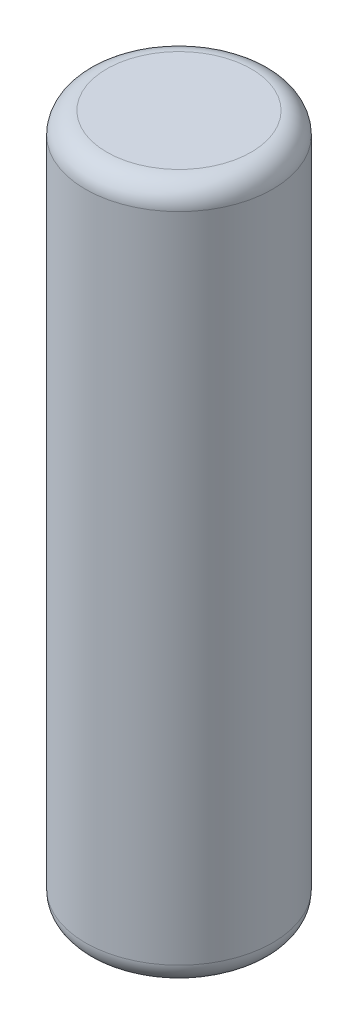
ISO-10303-21;
HEADER;
FILE_DESCRIPTION(('STEP AP214'),'2;1');
FILE_NAME('part.step','',(''),(''),'','','');
FILE_SCHEMA(('AUTOMOTIVE_DESIGN { 1 0 10303 214 1 1 1 1 }'));
ENDSEC;
DATA;
#1=APPLICATION_CONTEXT('core data for automotive mechanical design processes');
#2=APPLICATION_PROTOCOL_DEFINITION('international standard','automotive_design',2000,#1);
#3=PRODUCT_CONTEXT('',#1,'mechanical');
#4=PRODUCT('Part','Part','',(#3));
#5=PRODUCT_RELATED_PRODUCT_CATEGORY('part','',(#4));
#6=PRODUCT_DEFINITION_FORMATION('','',#4);
#7=PRODUCT_DEFINITION_CONTEXT('part definition',#1,'design');
#8=PRODUCT_DEFINITION('design','',#6,#7);
#9=PRODUCT_DEFINITION_SHAPE('','',#8);
#10=(LENGTH_UNIT() NAMED_UNIT(*) SI_UNIT(.MILLI.,.METRE.));
#11=(NAMED_UNIT(*) PLANE_ANGLE_UNIT() SI_UNIT($,.RADIAN.));
#12=(NAMED_UNIT(*) SI_UNIT($,.STERADIAN.) SOLID_ANGLE_UNIT());
#13=UNCERTAINTY_MEASURE_WITH_UNIT(LENGTH_MEASURE(1.E-05),#10,'distance_accuracy_value','');
#14=(GEOMETRIC_REPRESENTATION_CONTEXT(3) GLOBAL_UNCERTAINTY_ASSIGNED_CONTEXT((#13)) GLOBAL_UNIT_ASSIGNED_CONTEXT((#10,
#11,#12)) REPRESENTATION_CONTEXT('',''));
#15=CARTESIAN_POINT('',(0.,0.,0.));
#16=DIRECTION('',(0.,0.,1.));
#17=DIRECTION('',(1.,0.,0.));
#18=AXIS2_PLACEMENT_3D('',#15,#16,#17);
#19=CARTESIAN_POINT('',(0.,66.04,0.));
#20=DIRECTION('',(0.,-1.,0.));
#21=DIRECTION('',(0.,0.,-1.));
#22=AXIS2_PLACEMENT_3D('',#19,#20,#21);
#23=CYLINDRICAL_SURFACE('',#22,8.89);
#24=CARTESIAN_POINT('',(0.,2.03200000000001,0.));
#25=DIRECTION('',(0.,1.,0.));
#26=DIRECTION('',(0.,0.,1.));
#27=AXIS2_PLACEMENT_3D('',#24,#25,#26);
#28=CIRCLE('',#27,8.89);
#29=CARTESIAN_POINT('',(0.,2.03200000000001,8.89));
#30=VERTEX_POINT('',#29);
#31=EDGE_CURVE('E42',#30,#30,#28,.T.);
#32=ORIENTED_EDGE('',*,*,#31,.T.);
#33=EDGE_LOOP('',(#32));
#34=FACE_BOUND('',#33,.T.);
#35=CARTESIAN_POINT('',(0.,64.008,0.));
#36=DIRECTION('',(0.,1.,0.));
#37=DIRECTION('',(0.,0.,1.));
#38=AXIS2_PLACEMENT_3D('',#35,#36,#37);
#39=CIRCLE('',#38,8.89);
#40=CARTESIAN_POINT('',(0.,64.008,8.89));
#41=VERTEX_POINT('',#40);
#42=EDGE_CURVE('E46',#41,#41,#39,.F.);
#43=ORIENTED_EDGE('',*,*,#42,.T.);
#44=EDGE_LOOP('',(#43));
#45=FACE_BOUND('',#44,.T.);
#46=ADVANCED_FACE('F31',(#34,#45),#23,.T.);
#47=CARTESIAN_POINT('',(0.,66.04,0.));
#48=DIRECTION('',(0.,1.,0.));
#49=DIRECTION('',(0.,0.,1.));
#50=AXIS2_PLACEMENT_3D('',#47,#48,#49);
#51=PLANE('',#50);
#52=CARTESIAN_POINT('',(0.,66.04,0.));
#53=DIRECTION('',(0.,1.,0.));
#54=DIRECTION('',(0.,0.,1.));
#55=AXIS2_PLACEMENT_3D('',#52,#53,#54);
#56=CIRCLE('',#55,6.858);
#57=CARTESIAN_POINT('',(0.,66.04,6.858));
#58=VERTEX_POINT('',#57);
#59=EDGE_CURVE('E10',#58,#58,#56,.T.);
#60=ORIENTED_EDGE('',*,*,#59,.T.);
#61=EDGE_LOOP('',(#60));
#62=FACE_BOUND('',#61,.T.);
#63=ADVANCED_FACE('F62',(#62),#51,.T.);
#64=CARTESIAN_POINT('',(0.,0.,0.));
#65=DIRECTION('',(0.,1.,0.));
#66=DIRECTION('',(0.,0.,1.));
#67=AXIS2_PLACEMENT_3D('',#64,#65,#66);
#68=PLANE('',#67);
#69=CARTESIAN_POINT('',(0.,0.,0.));
#70=DIRECTION('',(0.,1.,0.));
#71=DIRECTION('',(0.,0.,1.));
#72=AXIS2_PLACEMENT_3D('',#69,#70,#71);
#73=CIRCLE('',#72,6.858);
#74=CARTESIAN_POINT('',(0.,0.,6.858));
#75=VERTEX_POINT('',#74);
#76=EDGE_CURVE('E38',#75,#75,#73,.F.);
#77=ORIENTED_EDGE('',*,*,#76,.T.);
#78=EDGE_LOOP('',(#77));
#79=FACE_BOUND('',#78,.T.);
#80=ADVANCED_FACE('F59',(#79),#68,.F.);
#81=CARTESIAN_POINT('',(0.,2.03200000000001,0.));
#82=DIRECTION('',(0.,1.,0.));
#83=DIRECTION('',(0.,0.,1.));
#84=AXIS2_PLACEMENT_3D('',#81,#82,#83);
#85=TOROIDAL_SURFACE('',#84,6.858,2.032);
#86=ORIENTED_EDGE('',*,*,#76,.F.);
#87=EDGE_LOOP('',(#86));
#88=FACE_BOUND('',#87,.T.);
#89=ORIENTED_EDGE('',*,*,#31,.F.);
#90=EDGE_LOOP('',(#89));
#91=FACE_BOUND('',#90,.T.);
#92=ADVANCED_FACE('F55',(#88,#91),#85,.T.);
#93=CARTESIAN_POINT('',(0.,64.008,0.));
#94=DIRECTION('',(0.,1.,0.));
#95=DIRECTION('',(0.,0.,1.));
#96=AXIS2_PLACEMENT_3D('',#93,#94,#95);
#97=TOROIDAL_SURFACE('',#96,6.858,2.032);
#98=ORIENTED_EDGE('',*,*,#42,.F.);
#99=EDGE_LOOP('',(#98));
#100=FACE_BOUND('',#99,.T.);
#101=ORIENTED_EDGE('',*,*,#59,.F.);
#102=EDGE_LOOP('',(#101));
#103=FACE_BOUND('',#102,.T.);
#104=ADVANCED_FACE('F33',(#100,#103),#97,.T.);
#105=CLOSED_SHELL('',(#46,#63,#80,#92,#104));
#106=MANIFOLD_SOLID_BREP('B2',#105);
#107=ADVANCED_BREP_SHAPE_REPRESENTATION('',(#18,#106),#14);
#108=SHAPE_DEFINITION_REPRESENTATION(#9,#107);
ENDSEC;
END-ISO-10303-21;
